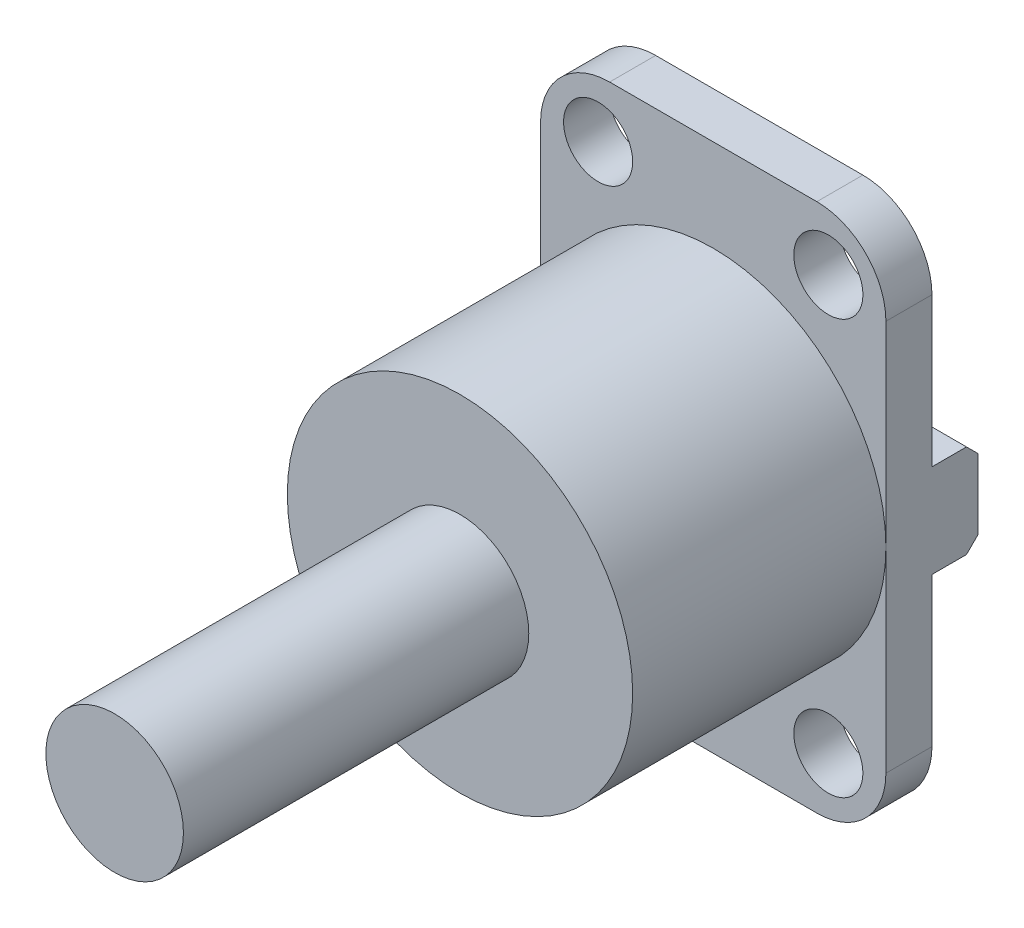
ISO-10303-21;
HEADER;
FILE_DESCRIPTION(('STEP AP214'),'2;1');
FILE_NAME('part.step','',(''),(''),'','','');
FILE_SCHEMA(('AUTOMOTIVE_DESIGN { 1 0 10303 214 1 1 1 1 }'));
ENDSEC;
DATA;
#1=APPLICATION_CONTEXT('core data for automotive mechanical design processes');
#2=APPLICATION_PROTOCOL_DEFINITION('international standard','automotive_design',2000,#1);
#3=PRODUCT_CONTEXT('',#1,'mechanical');
#4=PRODUCT('Part','Part','',(#3));
#5=PRODUCT_RELATED_PRODUCT_CATEGORY('part','',(#4));
#6=PRODUCT_DEFINITION_FORMATION('','',#4);
#7=PRODUCT_DEFINITION_CONTEXT('part definition',#1,'design');
#8=PRODUCT_DEFINITION('design','',#6,#7);
#9=PRODUCT_DEFINITION_SHAPE('','',#8);
#10=(LENGTH_UNIT() NAMED_UNIT(*) SI_UNIT(.MILLI.,.METRE.));
#11=(NAMED_UNIT(*) PLANE_ANGLE_UNIT() SI_UNIT($,.RADIAN.));
#12=(NAMED_UNIT(*) SI_UNIT($,.STERADIAN.) SOLID_ANGLE_UNIT());
#13=UNCERTAINTY_MEASURE_WITH_UNIT(LENGTH_MEASURE(1.E-05),#10,'distance_accuracy_value','');
#14=(GEOMETRIC_REPRESENTATION_CONTEXT(3) GLOBAL_UNCERTAINTY_ASSIGNED_CONTEXT((#13)) GLOBAL_UNIT_ASSIGNED_CONTEXT((#10,
#11,#12)) REPRESENTATION_CONTEXT('',''));
#15=CARTESIAN_POINT('',(0.,0.,0.));
#16=DIRECTION('',(0.,0.,1.));
#17=DIRECTION('',(1.,0.,0.));
#18=AXIS2_PLACEMENT_3D('',#15,#16,#17);
#19=CARTESIAN_POINT('',(0.,0.,0.));
#20=DIRECTION('',(0.,0.,1.));
#21=DIRECTION('',(1.,0.,0.));
#22=AXIS2_PLACEMENT_3D('',#19,#20,#21);
#23=PLANE('',#22);
#24=CARTESIAN_POINT('',(5.,9.,0.));
#25=DIRECTION('',(0.,0.,1.));
#26=DIRECTION('',(-1.,0.,0.));
#27=AXIS2_PLACEMENT_3D('',#24,#25,#26);
#28=CIRCLE('',#27,1.5);
#29=CARTESIAN_POINT('',(3.5,9.,0.));
#30=VERTEX_POINT('',#29);
#31=EDGE_CURVE('E225',#30,#30,#28,.T.);
#32=ORIENTED_EDGE('',*,*,#31,.T.);
#33=EDGE_LOOP('',(#32));
#34=FACE_BOUND('',#33,.T.);
#35=CARTESIAN_POINT('',(-5.,9.,0.));
#36=DIRECTION('',(0.,0.,1.));
#37=DIRECTION('',(1.,0.,0.));
#38=AXIS2_PLACEMENT_3D('',#35,#36,#37);
#39=CIRCLE('',#38,1.5);
#40=CARTESIAN_POINT('',(-3.5,9.,0.));
#41=VERTEX_POINT('',#40);
#42=EDGE_CURVE('E233',#41,#41,#39,.T.);
#43=ORIENTED_EDGE('',*,*,#42,.T.);
#44=EDGE_LOOP('',(#43));
#45=FACE_BOUND('',#44,.T.);
#46=DIRECTION('',(0.,-1.,0.));
#47=VECTOR('',#46,1.);
#48=CARTESIAN_POINT('',(-7.5,11.5,0.));
#49=LINE('',#48,#47);
#50=CARTESIAN_POINT('',(-7.5,8.5,0.));
#51=VERTEX_POINT('',#50);
#52=CARTESIAN_POINT('',(-7.5,2.025,0.));
#53=VERTEX_POINT('',#52);
#54=EDGE_CURVE('E169',#51,#53,#49,.T.);
#55=ORIENTED_EDGE('',*,*,#54,.F.);
#56=CARTESIAN_POINT('',(-4.5,8.5,0.));
#57=DIRECTION('',(0.,0.,1.));
#58=DIRECTION('',(1.,0.,0.));
#59=AXIS2_PLACEMENT_3D('',#56,#57,#58);
#60=CIRCLE('',#59,3.);
#61=CARTESIAN_POINT('',(-4.5,11.5,0.));
#62=VERTEX_POINT('',#61);
#63=EDGE_CURVE('E329',#51,#62,#60,.F.);
#64=ORIENTED_EDGE('',*,*,#63,.T.);
#65=DIRECTION('',(-1.,0.,0.));
#66=VECTOR('',#65,1.);
#67=CARTESIAN_POINT('',(-7.5,11.5,0.));
#68=LINE('',#67,#66);
#69=CARTESIAN_POINT('',(4.5,11.5,0.));
#70=VERTEX_POINT('',#69);
#71=EDGE_CURVE('E267',#70,#62,#68,.T.);
#72=ORIENTED_EDGE('',*,*,#71,.F.);
#73=CARTESIAN_POINT('',(4.5,8.5,0.));
#74=DIRECTION('',(0.,0.,1.));
#75=DIRECTION('',(1.,0.,0.));
#76=AXIS2_PLACEMENT_3D('',#73,#74,#75);
#77=CIRCLE('',#76,3.);
#78=CARTESIAN_POINT('',(7.5,8.5,0.));
#79=VERTEX_POINT('',#78);
#80=EDGE_CURVE('E326',#70,#79,#77,.F.);
#81=ORIENTED_EDGE('',*,*,#80,.T.);
#82=DIRECTION('',(0.,1.,0.));
#83=VECTOR('',#82,1.);
#84=CARTESIAN_POINT('',(7.5,11.5,0.));
#85=LINE('',#84,#83);
#86=CARTESIAN_POINT('',(7.5,2.025,0.));
#87=VERTEX_POINT('',#86);
#88=EDGE_CURVE('E263',#87,#79,#85,.T.);
#89=ORIENTED_EDGE('',*,*,#88,.F.);
#90=DIRECTION('',(1.,0.,0.));
#91=VECTOR('',#90,1.);
#92=CARTESIAN_POINT('',(7.5,2.025,0.));
#93=LINE('',#92,#91);
#94=EDGE_CURVE('E176',#53,#87,#93,.T.);
#95=ORIENTED_EDGE('',*,*,#94,.F.);
#96=EDGE_LOOP('',(#55,#64,#72,#81,#89,#95));
#97=FACE_BOUND('',#96,.T.);
#98=ADVANCED_FACE('F39',(#34,#45,#97),#23,.F.);
#99=CARTESIAN_POINT('',(-5.,-9.,0.));
#100=DIRECTION('',(0.,0.,1.));
#101=DIRECTION('',(-1.,0.,0.));
#102=AXIS2_PLACEMENT_3D('',#99,#100,#101);
#103=CIRCLE('',#102,1.5);
#104=CARTESIAN_POINT('',(-6.5,-9.,0.));
#105=VERTEX_POINT('',#104);
#106=EDGE_CURVE('E209',#105,#105,#103,.T.);
#107=ORIENTED_EDGE('',*,*,#106,.T.);
#108=EDGE_LOOP('',(#107));
#109=FACE_BOUND('',#108,.T.);
#110=CARTESIAN_POINT('',(5.,-9.,0.));
#111=DIRECTION('',(0.,0.,1.));
#112=DIRECTION('',(1.,0.,0.));
#113=AXIS2_PLACEMENT_3D('',#110,#111,#112);
#114=CIRCLE('',#113,1.5);
#115=CARTESIAN_POINT('',(6.5,-9.,0.));
#116=VERTEX_POINT('',#115);
#117=EDGE_CURVE('E217',#116,#116,#114,.T.);
#118=ORIENTED_EDGE('',*,*,#117,.T.);
#119=EDGE_LOOP('',(#118));
#120=FACE_BOUND('',#119,.T.);
#121=DIRECTION('',(1.,0.,0.));
#122=VECTOR('',#121,1.);
#123=CARTESIAN_POINT('',(-7.5,-11.5,0.));
#124=LINE('',#123,#122);
#125=CARTESIAN_POINT('',(-4.5,-11.5,0.));
#126=VERTEX_POINT('',#125);
#127=CARTESIAN_POINT('',(4.5,-11.5,0.));
#128=VERTEX_POINT('',#127);
#129=EDGE_CURVE('E259',#126,#128,#124,.T.);
#130=ORIENTED_EDGE('',*,*,#129,.F.);
#131=CARTESIAN_POINT('',(-4.5,-8.5,0.));
#132=DIRECTION('',(0.,0.,1.));
#133=DIRECTION('',(1.,0.,0.));
#134=AXIS2_PLACEMENT_3D('',#131,#132,#133);
#135=CIRCLE('',#134,3.);
#136=CARTESIAN_POINT('',(-7.5,-8.5,0.));
#137=VERTEX_POINT('',#136);
#138=EDGE_CURVE('E167',#126,#137,#135,.F.);
#139=ORIENTED_EDGE('',*,*,#138,.T.);
#140=CARTESIAN_POINT('',(-7.5,-2.025,0.));
#141=VERTEX_POINT('',#140);
#142=EDGE_CURVE('E150',#141,#137,#49,.T.);
#143=ORIENTED_EDGE('',*,*,#142,.F.);
#144=DIRECTION('',(-1.,0.,0.));
#145=VECTOR('',#144,1.);
#146=CARTESIAN_POINT('',(7.5,-2.025,0.));
#147=LINE('',#146,#145);
#148=CARTESIAN_POINT('',(7.5,-2.025,0.));
#149=VERTEX_POINT('',#148);
#150=EDGE_CURVE('E166',#149,#141,#147,.T.);
#151=ORIENTED_EDGE('',*,*,#150,.F.);
#152=CARTESIAN_POINT('',(7.5,-8.5,0.));
#153=VERTEX_POINT('',#152);
#154=EDGE_CURVE('E264',#153,#149,#85,.T.);
#155=ORIENTED_EDGE('',*,*,#154,.F.);
#156=CARTESIAN_POINT('',(4.5,-8.5,0.));
#157=DIRECTION('',(0.,0.,1.));
#158=DIRECTION('',(1.,0.,0.));
#159=AXIS2_PLACEMENT_3D('',#156,#157,#158);
#160=CIRCLE('',#159,3.);
#161=EDGE_CURVE('E301',#153,#128,#160,.F.);
#162=ORIENTED_EDGE('',*,*,#161,.T.);
#163=EDGE_LOOP('',(#130,#139,#143,#151,#155,#162));
#164=FACE_BOUND('',#163,.T.);
#165=ADVANCED_FACE('F164',(#109,#120,#164),#23,.F.);
#166=CARTESIAN_POINT('',(0.,0.,2.));
#167=DIRECTION('',(0.,0.,1.));
#168=DIRECTION('',(1.,0.,0.));
#169=AXIS2_PLACEMENT_3D('',#166,#167,#168);
#170=PLANE('',#169);
#171=DIRECTION('',(-1.,0.,0.));
#172=VECTOR('',#171,1.);
#173=CARTESIAN_POINT('',(-7.5,11.5,2.));
#174=LINE('',#173,#172);
#175=CARTESIAN_POINT('',(4.5,11.5,2.));
#176=VERTEX_POINT('',#175);
#177=CARTESIAN_POINT('',(-4.5,11.5,2.));
#178=VERTEX_POINT('',#177);
#179=EDGE_CURVE('E255',#176,#178,#174,.T.);
#180=ORIENTED_EDGE('',*,*,#179,.T.);
#181=CARTESIAN_POINT('',(-4.5,8.5,2.));
#182=DIRECTION('',(0.,0.,1.));
#183=DIRECTION('',(1.,0.,0.));
#184=AXIS2_PLACEMENT_3D('',#181,#182,#183);
#185=CIRCLE('',#184,3.);
#186=CARTESIAN_POINT('',(-7.5,8.5,2.));
#187=VERTEX_POINT('',#186);
#188=EDGE_CURVE('E11',#178,#187,#185,.T.);
#189=ORIENTED_EDGE('',*,*,#188,.T.);
#190=DIRECTION('',(0.,-1.,0.));
#191=VECTOR('',#190,1.);
#192=CARTESIAN_POINT('',(-7.5,11.5,2.));
#193=LINE('',#192,#191);
#194=CARTESIAN_POINT('',(-7.5,0.,2.));
#195=VERTEX_POINT('',#194);
#196=EDGE_CURVE('E243',#187,#195,#193,.T.);
#197=ORIENTED_EDGE('',*,*,#196,.T.);
#198=CARTESIAN_POINT('',(0.,0.,2.));
#199=DIRECTION('',(0.,0.,1.));
#200=DIRECTION('',(1.,0.,0.));
#201=AXIS2_PLACEMENT_3D('',#198,#199,#200);
#202=CIRCLE('',#201,7.5);
#203=CARTESIAN_POINT('',(7.5,0.,2.));
#204=VERTEX_POINT('',#203);
#205=EDGE_CURVE('E198',#204,#195,#202,.T.);
#206=ORIENTED_EDGE('',*,*,#205,.F.);
#207=DIRECTION('',(0.,1.,0.));
#208=VECTOR('',#207,1.);
#209=CARTESIAN_POINT('',(7.5,11.5,2.));
#210=LINE('',#209,#208);
#211=CARTESIAN_POINT('',(7.5,8.5,2.));
#212=VERTEX_POINT('',#211);
#213=EDGE_CURVE('E251',#204,#212,#210,.T.);
#214=ORIENTED_EDGE('',*,*,#213,.T.);
#215=CARTESIAN_POINT('',(4.5,8.5,2.));
#216=DIRECTION('',(0.,0.,1.));
#217=DIRECTION('',(1.,0.,0.));
#218=AXIS2_PLACEMENT_3D('',#215,#216,#217);
#219=CIRCLE('',#218,3.);
#220=EDGE_CURVE('E48',#212,#176,#219,.T.);
#221=ORIENTED_EDGE('',*,*,#220,.T.);
#222=EDGE_LOOP('',(#180,#189,#197,#206,#214,#221));
#223=FACE_BOUND('',#222,.T.);
#224=CARTESIAN_POINT('',(5.,9.,2.));
#225=DIRECTION('',(0.,0.,1.));
#226=DIRECTION('',(-1.,0.,0.));
#227=AXIS2_PLACEMENT_3D('',#224,#225,#226);
#228=CIRCLE('',#227,1.5);
#229=CARTESIAN_POINT('',(3.5,9.,2.));
#230=VERTEX_POINT('',#229);
#231=EDGE_CURVE('E229',#230,#230,#228,.T.);
#232=ORIENTED_EDGE('',*,*,#231,.F.);
#233=EDGE_LOOP('',(#232));
#234=FACE_BOUND('',#233,.T.);
#235=CARTESIAN_POINT('',(-5.,9.,2.));
#236=DIRECTION('',(0.,0.,1.));
#237=DIRECTION('',(1.,0.,0.));
#238=AXIS2_PLACEMENT_3D('',#235,#236,#237);
#239=CIRCLE('',#238,1.5);
#240=CARTESIAN_POINT('',(-3.5,9.,2.));
#241=VERTEX_POINT('',#240);
#242=EDGE_CURVE('E170',#241,#241,#239,.T.);
#243=ORIENTED_EDGE('',*,*,#242,.F.);
#244=EDGE_LOOP('',(#243));
#245=FACE_BOUND('',#244,.T.);
#246=ADVANCED_FACE('F376',(#223,#234,#245),#170,.T.);
#247=CARTESIAN_POINT('',(-7.5,-8.5,2.));
#248=VERTEX_POINT('',#247);
#249=EDGE_CURVE('E247',#195,#248,#193,.T.);
#250=ORIENTED_EDGE('',*,*,#249,.T.);
#251=CARTESIAN_POINT('',(-4.5,-8.5,2.));
#252=DIRECTION('',(0.,0.,1.));
#253=DIRECTION('',(1.,0.,0.));
#254=AXIS2_PLACEMENT_3D('',#251,#252,#253);
#255=CIRCLE('',#254,3.);
#256=CARTESIAN_POINT('',(-4.5,-11.5,2.));
#257=VERTEX_POINT('',#256);
#258=EDGE_CURVE('E316',#248,#257,#255,.T.);
#259=ORIENTED_EDGE('',*,*,#258,.T.);
#260=DIRECTION('',(1.,0.,0.));
#261=VECTOR('',#260,1.);
#262=CARTESIAN_POINT('',(-7.5,-11.5,2.));
#263=LINE('',#262,#261);
#264=CARTESIAN_POINT('',(4.5,-11.5,2.));
#265=VERTEX_POINT('',#264);
#266=EDGE_CURVE('E246',#257,#265,#263,.T.);
#267=ORIENTED_EDGE('',*,*,#266,.T.);
#268=CARTESIAN_POINT('',(4.5,-8.5,2.));
#269=DIRECTION('',(0.,0.,1.));
#270=DIRECTION('',(1.,0.,0.));
#271=AXIS2_PLACEMENT_3D('',#268,#269,#270);
#272=CIRCLE('',#271,3.);
#273=CARTESIAN_POINT('',(7.5,-8.5,2.));
#274=VERTEX_POINT('',#273);
#275=EDGE_CURVE('E313',#265,#274,#272,.T.);
#276=ORIENTED_EDGE('',*,*,#275,.T.);
#277=EDGE_CURVE('E252',#274,#204,#210,.T.);
#278=ORIENTED_EDGE('',*,*,#277,.T.);
#279=EDGE_CURVE('E204',#195,#204,#202,.T.);
#280=ORIENTED_EDGE('',*,*,#279,.F.);
#281=EDGE_LOOP('',(#250,#259,#267,#276,#278,#280));
#282=FACE_BOUND('',#281,.T.);
#283=CARTESIAN_POINT('',(5.,-9.,2.));
#284=DIRECTION('',(0.,0.,1.));
#285=DIRECTION('',(1.,0.,0.));
#286=AXIS2_PLACEMENT_3D('',#283,#284,#285);
#287=CIRCLE('',#286,1.5);
#288=CARTESIAN_POINT('',(6.5,-9.,2.));
#289=VERTEX_POINT('',#288);
#290=EDGE_CURVE('E221',#289,#289,#287,.T.);
#291=ORIENTED_EDGE('',*,*,#290,.F.);
#292=EDGE_LOOP('',(#291));
#293=FACE_BOUND('',#292,.T.);
#294=CARTESIAN_POINT('',(-5.,-9.,2.));
#295=DIRECTION('',(0.,0.,1.));
#296=DIRECTION('',(-1.,0.,0.));
#297=AXIS2_PLACEMENT_3D('',#294,#295,#296);
#298=CIRCLE('',#297,1.5);
#299=CARTESIAN_POINT('',(-6.5,-9.,2.));
#300=VERTEX_POINT('',#299);
#301=EDGE_CURVE('E213',#300,#300,#298,.T.);
#302=ORIENTED_EDGE('',*,*,#301,.F.);
#303=EDGE_LOOP('',(#302));
#304=FACE_BOUND('',#303,.T.);
#305=ADVANCED_FACE('F370',(#282,#293,#304),#170,.T.);
#306=CARTESIAN_POINT('',(-7.5,11.5,2.));
#307=DIRECTION('',(1.,0.,0.));
#308=DIRECTION('',(0.,1.,0.));
#309=AXIS2_PLACEMENT_3D('',#306,#307,#308);
#310=PLANE('',#309);
#311=ORIENTED_EDGE('',*,*,#142,.T.);
#312=DIRECTION('',(0.,0.,-1.));
#313=VECTOR('',#312,1.);
#314=CARTESIAN_POINT('',(-7.5,-8.5,2.));
#315=LINE('',#314,#313);
#316=EDGE_CURVE('E310',#137,#248,#315,.F.);
#317=ORIENTED_EDGE('',*,*,#316,.T.);
#318=ORIENTED_EDGE('',*,*,#249,.F.);
#319=ORIENTED_EDGE('',*,*,#196,.F.);
#320=DIRECTION('',(0.,0.,-1.));
#321=VECTOR('',#320,1.);
#322=CARTESIAN_POINT('',(-7.5,8.5,2.));
#323=LINE('',#322,#321);
#324=EDGE_CURVE('E306',#187,#51,#323,.T.);
#325=ORIENTED_EDGE('',*,*,#324,.T.);
#326=ORIENTED_EDGE('',*,*,#54,.T.);
#327=DIRECTION('',(0.,0.,1.));
#328=VECTOR('',#327,1.);
#329=CARTESIAN_POINT('',(-7.5,2.025,-2.));
#330=LINE('',#329,#328);
#331=CARTESIAN_POINT('',(-7.5,2.025,-1.5));
#332=VERTEX_POINT('',#331);
#333=EDGE_CURVE('E159',#332,#53,#330,.T.);
#334=ORIENTED_EDGE('',*,*,#333,.F.);
#335=DIRECTION('',(0.,-0.707106781186548,-0.707106781186548));
#336=VECTOR('',#335,1.);
#337=CARTESIAN_POINT('',(-7.5,1.525,-2.));
#338=LINE('',#337,#336);
#339=CARTESIAN_POINT('',(-7.5,1.525,-2.));
#340=VERTEX_POINT('',#339);
#341=EDGE_CURVE('E277',#332,#340,#338,.T.);
#342=ORIENTED_EDGE('',*,*,#341,.T.);
#343=DIRECTION('',(0.,1.,0.));
#344=VECTOR('',#343,1.);
#345=CARTESIAN_POINT('',(-7.5,2.025,-2.));
#346=LINE('',#345,#344);
#347=CARTESIAN_POINT('',(-7.5,-1.525,-2.));
#348=VERTEX_POINT('',#347);
#349=EDGE_CURVE('E183',#348,#340,#346,.T.);
#350=ORIENTED_EDGE('',*,*,#349,.F.);
#351=DIRECTION('',(0.,-0.707106781186548,0.707106781186548));
#352=VECTOR('',#351,1.);
#353=CARTESIAN_POINT('',(-7.5,-1.525,-2.));
#354=LINE('',#353,#352);
#355=CARTESIAN_POINT('',(-7.5,-2.025,-1.5));
#356=VERTEX_POINT('',#355);
#357=EDGE_CURVE('E153',#348,#356,#354,.T.);
#358=ORIENTED_EDGE('',*,*,#357,.T.);
#359=DIRECTION('',(0.,0.,1.));
#360=VECTOR('',#359,1.);
#361=CARTESIAN_POINT('',(-7.5,-2.025,-2.));
#362=LINE('',#361,#360);
#363=EDGE_CURVE('E147',#356,#141,#362,.T.);
#364=ORIENTED_EDGE('',*,*,#363,.T.);
#365=EDGE_LOOP('',(#311,#317,#318,#319,#325,#326,#334,#342,#350,#358,#364));
#366=FACE_BOUND('',#365,.T.);
#367=ADVANCED_FACE('F149',(#366),#310,.F.);
#368=CARTESIAN_POINT('',(-7.5,-11.5,2.));
#369=DIRECTION('',(0.,1.,0.));
#370=DIRECTION('',(-1.,0.,0.));
#371=AXIS2_PLACEMENT_3D('',#368,#369,#370);
#372=PLANE('',#371);
#373=ORIENTED_EDGE('',*,*,#266,.F.);
#374=DIRECTION('',(0.,0.,-1.));
#375=VECTOR('',#374,1.);
#376=CARTESIAN_POINT('',(-4.5,-11.5,2.));
#377=LINE('',#376,#375);
#378=EDGE_CURVE('E297',#257,#126,#377,.T.);
#379=ORIENTED_EDGE('',*,*,#378,.T.);
#380=ORIENTED_EDGE('',*,*,#129,.T.);
#381=DIRECTION('',(0.,0.,-1.));
#382=VECTOR('',#381,1.);
#383=CARTESIAN_POINT('',(4.5,-11.5,2.));
#384=LINE('',#383,#382);
#385=EDGE_CURVE('E294',#128,#265,#384,.F.);
#386=ORIENTED_EDGE('',*,*,#385,.T.);
#387=EDGE_LOOP('',(#373,#379,#380,#386));
#388=FACE_BOUND('',#387,.T.);
#389=ADVANCED_FACE('F365',(#388),#372,.F.);
#390=CARTESIAN_POINT('',(7.5,11.5,2.));
#391=DIRECTION('',(-1.,0.,0.));
#392=DIRECTION('',(0.,-1.,0.));
#393=AXIS2_PLACEMENT_3D('',#390,#391,#392);
#394=PLANE('',#393);
#395=ORIENTED_EDGE('',*,*,#277,.F.);
#396=DIRECTION('',(0.,0.,-1.));
#397=VECTOR('',#396,1.);
#398=CARTESIAN_POINT('',(7.5,-8.5,2.));
#399=LINE('',#398,#397);
#400=EDGE_CURVE('E322',#274,#153,#399,.T.);
#401=ORIENTED_EDGE('',*,*,#400,.T.);
#402=ORIENTED_EDGE('',*,*,#154,.T.);
#403=DIRECTION('',(0.,0.,1.));
#404=VECTOR('',#403,1.);
#405=CARTESIAN_POINT('',(7.5,-2.025,-2.));
#406=LINE('',#405,#404);
#407=CARTESIAN_POINT('',(7.5,-2.025,-1.5));
#408=VERTEX_POINT('',#407);
#409=EDGE_CURVE('E158',#408,#149,#406,.T.);
#410=ORIENTED_EDGE('',*,*,#409,.F.);
#411=DIRECTION('',(0.,0.707106781186548,-0.707106781186548));
#412=VECTOR('',#411,1.);
#413=CARTESIAN_POINT('',(7.5,-1.525,-2.));
#414=LINE('',#413,#412);
#415=CARTESIAN_POINT('',(7.5,-1.525,-2.));
#416=VERTEX_POINT('',#415);
#417=EDGE_CURVE('E288',#408,#416,#414,.T.);
#418=ORIENTED_EDGE('',*,*,#417,.T.);
#419=DIRECTION('',(0.,-1.,0.));
#420=VECTOR('',#419,1.);
#421=CARTESIAN_POINT('',(7.5,2.025,-2.));
#422=LINE('',#421,#420);
#423=CARTESIAN_POINT('',(7.5,1.525,-2.));
#424=VERTEX_POINT('',#423);
#425=EDGE_CURVE('E180',#424,#416,#422,.T.);
#426=ORIENTED_EDGE('',*,*,#425,.F.);
#427=DIRECTION('',(0.,0.707106781186548,0.707106781186548));
#428=VECTOR('',#427,1.);
#429=CARTESIAN_POINT('',(7.5,1.525,-2.));
#430=LINE('',#429,#428);
#431=CARTESIAN_POINT('',(7.5,2.025,-1.5));
#432=VERTEX_POINT('',#431);
#433=EDGE_CURVE('E285',#424,#432,#430,.T.);
#434=ORIENTED_EDGE('',*,*,#433,.T.);
#435=DIRECTION('',(0.,0.,1.));
#436=VECTOR('',#435,1.);
#437=CARTESIAN_POINT('',(7.5,2.025,-2.));
#438=LINE('',#437,#436);
#439=EDGE_CURVE('E186',#432,#87,#438,.T.);
#440=ORIENTED_EDGE('',*,*,#439,.T.);
#441=ORIENTED_EDGE('',*,*,#88,.T.);
#442=DIRECTION('',(0.,0.,-1.));
#443=VECTOR('',#442,1.);
#444=CARTESIAN_POINT('',(7.5,8.5,2.));
#445=LINE('',#444,#443);
#446=EDGE_CURVE('E319',#79,#212,#445,.F.);
#447=ORIENTED_EDGE('',*,*,#446,.T.);
#448=ORIENTED_EDGE('',*,*,#213,.F.);
#449=EDGE_LOOP('',(#395,#401,#402,#410,#418,#426,#434,#440,#441,#447,#448));
#450=FACE_BOUND('',#449,.T.);
#451=ADVANCED_FACE('F359',(#450),#394,.F.);
#452=CARTESIAN_POINT('',(-7.5,11.5,2.));
#453=DIRECTION('',(0.,-1.,0.));
#454=DIRECTION('',(0.,0.,-1.));
#455=AXIS2_PLACEMENT_3D('',#452,#453,#454);
#456=PLANE('',#455);
#457=ORIENTED_EDGE('',*,*,#71,.T.);
#458=DIRECTION('',(0.,0.,-1.));
#459=VECTOR('',#458,1.);
#460=CARTESIAN_POINT('',(-4.5,11.5,2.));
#461=LINE('',#460,#459);
#462=EDGE_CURVE('E55',#62,#178,#461,.F.);
#463=ORIENTED_EDGE('',*,*,#462,.T.);
#464=ORIENTED_EDGE('',*,*,#179,.F.);
#465=DIRECTION('',(0.,0.,-1.));
#466=VECTOR('',#465,1.);
#467=CARTESIAN_POINT('',(4.5,11.5,2.));
#468=LINE('',#467,#466);
#469=EDGE_CURVE('E332',#176,#70,#468,.T.);
#470=ORIENTED_EDGE('',*,*,#469,.T.);
#471=EDGE_LOOP('',(#457,#463,#464,#470));
#472=FACE_BOUND('',#471,.T.);
#473=ADVANCED_FACE('F408',(#472),#456,.F.);
#474=CARTESIAN_POINT('',(-5.,9.,2.));
#475=DIRECTION('',(0.,0.,-1.));
#476=DIRECTION('',(-1.,0.,0.));
#477=AXIS2_PLACEMENT_3D('',#474,#475,#476);
#478=CYLINDRICAL_SURFACE('',#477,1.5);
#479=ORIENTED_EDGE('',*,*,#242,.T.);
#480=EDGE_LOOP('',(#479));
#481=FACE_BOUND('',#480,.T.);
#482=ORIENTED_EDGE('',*,*,#42,.F.);
#483=EDGE_LOOP('',(#482));
#484=FACE_BOUND('',#483,.T.);
#485=ADVANCED_FACE('F411',(#481,#484),#478,.F.);
#486=CARTESIAN_POINT('',(5.,9.,2.));
#487=DIRECTION('',(0.,0.,-1.));
#488=DIRECTION('',(-1.,0.,0.));
#489=AXIS2_PLACEMENT_3D('',#486,#487,#488);
#490=CYLINDRICAL_SURFACE('',#489,1.5);
#491=ORIENTED_EDGE('',*,*,#231,.T.);
#492=EDGE_LOOP('',(#491));
#493=FACE_BOUND('',#492,.T.);
#494=ORIENTED_EDGE('',*,*,#31,.F.);
#495=EDGE_LOOP('',(#494));
#496=FACE_BOUND('',#495,.T.);
#497=ADVANCED_FACE('F454',(#493,#496),#490,.F.);
#498=CARTESIAN_POINT('',(5.,-9.,2.));
#499=DIRECTION('',(0.,0.,-1.));
#500=DIRECTION('',(-1.,0.,0.));
#501=AXIS2_PLACEMENT_3D('',#498,#499,#500);
#502=CYLINDRICAL_SURFACE('',#501,1.5);
#503=ORIENTED_EDGE('',*,*,#290,.T.);
#504=EDGE_LOOP('',(#503));
#505=FACE_BOUND('',#504,.T.);
#506=ORIENTED_EDGE('',*,*,#117,.F.);
#507=EDGE_LOOP('',(#506));
#508=FACE_BOUND('',#507,.T.);
#509=ADVANCED_FACE('F450',(#505,#508),#502,.F.);
#510=CARTESIAN_POINT('',(-5.,-9.,2.));
#511=DIRECTION('',(0.,0.,-1.));
#512=DIRECTION('',(-1.,0.,0.));
#513=AXIS2_PLACEMENT_3D('',#510,#511,#512);
#514=CYLINDRICAL_SURFACE('',#513,1.5);
#515=ORIENTED_EDGE('',*,*,#301,.T.);
#516=EDGE_LOOP('',(#515));
#517=FACE_BOUND('',#516,.T.);
#518=ORIENTED_EDGE('',*,*,#106,.F.);
#519=EDGE_LOOP('',(#518));
#520=FACE_BOUND('',#519,.T.);
#521=ADVANCED_FACE('F446',(#517,#520),#514,.F.);
#522=CARTESIAN_POINT('',(0.,0.,13.));
#523=DIRECTION('',(0.,0.,-1.));
#524=DIRECTION('',(-1.,0.,0.));
#525=AXIS2_PLACEMENT_3D('',#522,#523,#524);
#526=CYLINDRICAL_SURFACE('',#525,7.5);
#527=CARTESIAN_POINT('',(0.,0.,13.));
#528=DIRECTION('',(0.,0.,1.));
#529=DIRECTION('',(1.,0.,0.));
#530=AXIS2_PLACEMENT_3D('',#527,#528,#529);
#531=CIRCLE('',#530,7.5);
#532=CARTESIAN_POINT('',(7.5,0.,13.));
#533=VERTEX_POINT('',#532);
#534=EDGE_CURVE('E205',#533,#533,#531,.T.);
#535=ORIENTED_EDGE('',*,*,#534,.F.);
#536=EDGE_LOOP('',(#535));
#537=FACE_BOUND('',#536,.T.);
#538=ORIENTED_EDGE('',*,*,#205,.T.);
#539=ORIENTED_EDGE('',*,*,#279,.T.);
#540=EDGE_LOOP('',(#538,#539));
#541=FACE_BOUND('',#540,.T.);
#542=ADVANCED_FACE('F380',(#537,#541),#526,.T.);
#543=CARTESIAN_POINT('',(0.,0.,13.));
#544=DIRECTION('',(0.,0.,1.));
#545=DIRECTION('',(1.,0.,0.));
#546=AXIS2_PLACEMENT_3D('',#543,#544,#545);
#547=PLANE('',#546);
#548=CARTESIAN_POINT('',(0.,0.,13.));
#549=DIRECTION('',(0.,0.,1.));
#550=DIRECTION('',(1.,0.,0.));
#551=AXIS2_PLACEMENT_3D('',#548,#549,#550);
#552=CIRCLE('',#551,2.9875);
#553=CARTESIAN_POINT('',(2.9875,0.,13.));
#554=VERTEX_POINT('',#553);
#555=EDGE_CURVE('E199',#554,#554,#552,.T.);
#556=ORIENTED_EDGE('',*,*,#555,.F.);
#557=EDGE_LOOP('',(#556));
#558=FACE_BOUND('',#557,.T.);
#559=ORIENTED_EDGE('',*,*,#534,.T.);
#560=EDGE_LOOP('',(#559));
#561=FACE_BOUND('',#560,.T.);
#562=ADVANCED_FACE('F439',(#558,#561),#547,.T.);
#563=CARTESIAN_POINT('',(0.,0.,28.));
#564=DIRECTION('',(0.,0.,-1.));
#565=DIRECTION('',(-1.,0.,0.));
#566=AXIS2_PLACEMENT_3D('',#563,#564,#565);
#567=CYLINDRICAL_SURFACE('',#566,2.9875);
#568=CARTESIAN_POINT('',(0.,0.,28.));
#569=DIRECTION('',(0.,0.,1.));
#570=DIRECTION('',(1.,0.,0.));
#571=AXIS2_PLACEMENT_3D('',#568,#569,#570);
#572=CIRCLE('',#571,2.9875);
#573=CARTESIAN_POINT('',(2.9875,0.,28.));
#574=VERTEX_POINT('',#573);
#575=EDGE_CURVE('E194',#574,#574,#572,.T.);
#576=ORIENTED_EDGE('',*,*,#575,.F.);
#577=EDGE_LOOP('',(#576));
#578=FACE_BOUND('',#577,.T.);
#579=ORIENTED_EDGE('',*,*,#555,.T.);
#580=EDGE_LOOP('',(#579));
#581=FACE_BOUND('',#580,.T.);
#582=ADVANCED_FACE('F435',(#578,#581),#567,.T.);
#583=CARTESIAN_POINT('',(0.,0.,28.));
#584=DIRECTION('',(0.,0.,1.));
#585=DIRECTION('',(1.,0.,0.));
#586=AXIS2_PLACEMENT_3D('',#583,#584,#585);
#587=PLANE('',#586);
#588=ORIENTED_EDGE('',*,*,#575,.T.);
#589=EDGE_LOOP('',(#588));
#590=FACE_BOUND('',#589,.T.);
#591=ADVANCED_FACE('F432',(#590),#587,.T.);
#592=CARTESIAN_POINT('',(7.5,-2.025,-2.));
#593=DIRECTION('',(0.,1.,0.));
#594=DIRECTION('',(0.,0.,1.));
#595=AXIS2_PLACEMENT_3D('',#592,#593,#594);
#596=PLANE('',#595);
#597=ORIENTED_EDGE('',*,*,#363,.F.);
#598=DIRECTION('',(1.,0.,0.));
#599=VECTOR('',#598,1.);
#600=CARTESIAN_POINT('',(7.5,-2.025,-1.5));
#601=LINE('',#600,#599);
#602=EDGE_CURVE('E282',#356,#408,#601,.T.);
#603=ORIENTED_EDGE('',*,*,#602,.T.);
#604=ORIENTED_EDGE('',*,*,#409,.T.);
#605=ORIENTED_EDGE('',*,*,#150,.T.);
#606=EDGE_LOOP('',(#597,#603,#604,#605));
#607=FACE_BOUND('',#606,.T.);
#608=ADVANCED_FACE('F173',(#607),#596,.F.);
#609=CARTESIAN_POINT('',(7.5,2.025,-2.));
#610=DIRECTION('',(0.,-1.,0.));
#611=DIRECTION('',(1.,0.,0.));
#612=AXIS2_PLACEMENT_3D('',#609,#610,#611);
#613=PLANE('',#612);
#614=ORIENTED_EDGE('',*,*,#439,.F.);
#615=DIRECTION('',(-1.,0.,0.));
#616=VECTOR('',#615,1.);
#617=CARTESIAN_POINT('',(-7.5,2.025,-1.5));
#618=LINE('',#617,#616);
#619=EDGE_CURVE('E291',#432,#332,#618,.T.);
#620=ORIENTED_EDGE('',*,*,#619,.T.);
#621=ORIENTED_EDGE('',*,*,#333,.T.);
#622=ORIENTED_EDGE('',*,*,#94,.T.);
#623=EDGE_LOOP('',(#614,#620,#621,#622));
#624=FACE_BOUND('',#623,.T.);
#625=ADVANCED_FACE('F422',(#624),#613,.F.);
#626=CARTESIAN_POINT('',(0.,0.,-2.));
#627=DIRECTION('',(0.,0.,-1.));
#628=DIRECTION('',(-1.,0.,0.));
#629=AXIS2_PLACEMENT_3D('',#626,#627,#628);
#630=PLANE('',#629);
#631=ORIENTED_EDGE('',*,*,#425,.T.);
#632=DIRECTION('',(-1.,0.,0.));
#633=VECTOR('',#632,1.);
#634=CARTESIAN_POINT('',(-7.5,-1.525,-2.));
#635=LINE('',#634,#633);
#636=EDGE_CURVE('E273',#416,#348,#635,.T.);
#637=ORIENTED_EDGE('',*,*,#636,.T.);
#638=ORIENTED_EDGE('',*,*,#349,.T.);
#639=DIRECTION('',(1.,0.,0.));
#640=VECTOR('',#639,1.);
#641=CARTESIAN_POINT('',(7.5,1.525,-2.));
#642=LINE('',#641,#640);
#643=EDGE_CURVE('E203',#340,#424,#642,.T.);
#644=ORIENTED_EDGE('',*,*,#643,.T.);
#645=EDGE_LOOP('',(#631,#637,#638,#644));
#646=FACE_BOUND('',#645,.T.);
#647=ADVANCED_FACE('F352',(#646),#630,.T.);
#648=CARTESIAN_POINT('',(0.,-1.525,-2.));
#649=DIRECTION('',(0.,-0.707106781186547,-0.707106781186547));
#650=DIRECTION('',(1.,0.,0.));
#651=AXIS2_PLACEMENT_3D('',#648,#649,#650);
#652=PLANE('',#651);
#653=ORIENTED_EDGE('',*,*,#417,.F.);
#654=ORIENTED_EDGE('',*,*,#602,.F.);
#655=ORIENTED_EDGE('',*,*,#357,.F.);
#656=ORIENTED_EDGE('',*,*,#636,.F.);
#657=EDGE_LOOP('',(#653,#654,#655,#656));
#658=FACE_BOUND('',#657,.T.);
#659=ADVANCED_FACE('F357',(#658),#652,.T.);
#660=CARTESIAN_POINT('',(0.,1.525,-2.));
#661=DIRECTION('',(0.,0.707106781186547,-0.707106781186547));
#662=DIRECTION('',(-1.,0.,0.));
#663=AXIS2_PLACEMENT_3D('',#660,#661,#662);
#664=PLANE('',#663);
#665=ORIENTED_EDGE('',*,*,#341,.F.);
#666=ORIENTED_EDGE('',*,*,#619,.F.);
#667=ORIENTED_EDGE('',*,*,#433,.F.);
#668=ORIENTED_EDGE('',*,*,#643,.F.);
#669=EDGE_LOOP('',(#665,#666,#667,#668));
#670=FACE_BOUND('',#669,.T.);
#671=ADVANCED_FACE('F387',(#670),#664,.T.);
#672=CARTESIAN_POINT('',(-4.5,-8.5,2.));
#673=DIRECTION('',(0.,0.,-1.));
#674=DIRECTION('',(-1.,0.,0.));
#675=AXIS2_PLACEMENT_3D('',#672,#673,#674);
#676=CYLINDRICAL_SURFACE('',#675,3.);
#677=ORIENTED_EDGE('',*,*,#258,.F.);
#678=ORIENTED_EDGE('',*,*,#316,.F.);
#679=ORIENTED_EDGE('',*,*,#138,.F.);
#680=ORIENTED_EDGE('',*,*,#378,.F.);
#681=EDGE_LOOP('',(#677,#678,#679,#680));
#682=FACE_BOUND('',#681,.T.);
#683=ADVANCED_FACE('F385',(#682),#676,.T.);
#684=CARTESIAN_POINT('',(4.5,-8.5,2.));
#685=DIRECTION('',(0.,0.,-1.));
#686=DIRECTION('',(-1.,0.,0.));
#687=AXIS2_PLACEMENT_3D('',#684,#685,#686);
#688=CYLINDRICAL_SURFACE('',#687,3.);
#689=ORIENTED_EDGE('',*,*,#275,.F.);
#690=ORIENTED_EDGE('',*,*,#385,.F.);
#691=ORIENTED_EDGE('',*,*,#161,.F.);
#692=ORIENTED_EDGE('',*,*,#400,.F.);
#693=EDGE_LOOP('',(#689,#690,#691,#692));
#694=FACE_BOUND('',#693,.T.);
#695=ADVANCED_FACE('F368',(#694),#688,.T.);
#696=CARTESIAN_POINT('',(-4.5,8.5,2.));
#697=DIRECTION('',(0.,0.,-1.));
#698=DIRECTION('',(-1.,0.,0.));
#699=AXIS2_PLACEMENT_3D('',#696,#697,#698);
#700=CYLINDRICAL_SURFACE('',#699,3.);
#701=ORIENTED_EDGE('',*,*,#188,.F.);
#702=ORIENTED_EDGE('',*,*,#462,.F.);
#703=ORIENTED_EDGE('',*,*,#63,.F.);
#704=ORIENTED_EDGE('',*,*,#324,.F.);
#705=EDGE_LOOP('',(#701,#702,#703,#704));
#706=FACE_BOUND('',#705,.T.);
#707=ADVANCED_FACE('F393',(#706),#700,.T.);
#708=CARTESIAN_POINT('',(4.5,8.5,2.));
#709=DIRECTION('',(0.,0.,-1.));
#710=DIRECTION('',(-1.,0.,0.));
#711=AXIS2_PLACEMENT_3D('',#708,#709,#710);
#712=CYLINDRICAL_SURFACE('',#711,3.);
#713=ORIENTED_EDGE('',*,*,#220,.F.);
#714=ORIENTED_EDGE('',*,*,#446,.F.);
#715=ORIENTED_EDGE('',*,*,#80,.F.);
#716=ORIENTED_EDGE('',*,*,#469,.F.);
#717=EDGE_LOOP('',(#713,#714,#715,#716));
#718=FACE_BOUND('',#717,.T.);
#719=ADVANCED_FACE('F41',(#718),#712,.T.);
#720=CLOSED_SHELL('',(#98,#165,#246,#305,#367,#389,#451,#473,#485,#497,#509,#521,#542,#562,#582,
#591,#608,#625,#647,#659,#671,#683,#695,#707,#719));
#721=MANIFOLD_SOLID_BREP('B2',#720);
#722=ADVANCED_BREP_SHAPE_REPRESENTATION('',(#18,#721),#14);
#723=SHAPE_DEFINITION_REPRESENTATION(#9,#722);
ENDSEC;
END-ISO-10303-21;
